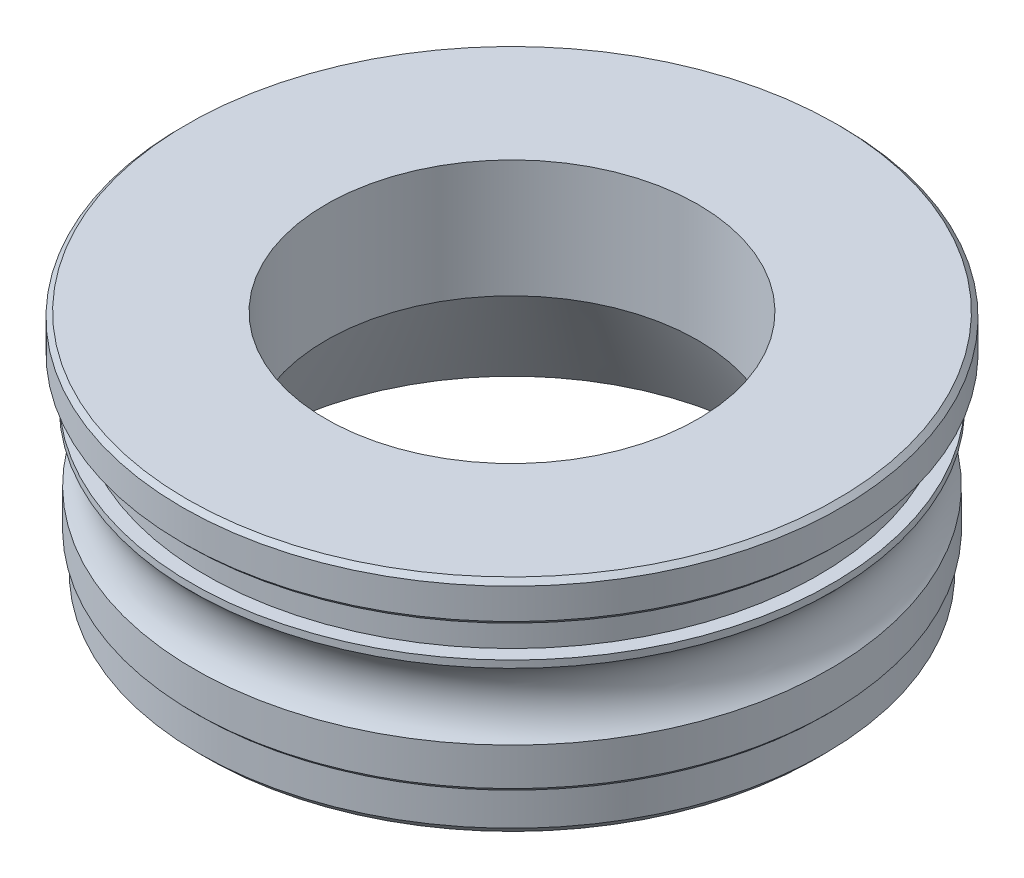
ISO-10303-21;
HEADER;
FILE_DESCRIPTION(('STEP AP214'),'2;1');
FILE_NAME('part.step','',(''),(''),'','','');
FILE_SCHEMA(('AUTOMOTIVE_DESIGN { 1 0 10303 214 1 1 1 1 }'));
ENDSEC;
DATA;
#1=APPLICATION_CONTEXT('core data for automotive mechanical design processes');
#2=APPLICATION_PROTOCOL_DEFINITION('international standard','automotive_design',2000,#1);
#3=PRODUCT_CONTEXT('',#1,'mechanical');
#4=PRODUCT('Part','Part','',(#3));
#5=PRODUCT_RELATED_PRODUCT_CATEGORY('part','',(#4));
#6=PRODUCT_DEFINITION_FORMATION('','',#4);
#7=PRODUCT_DEFINITION_CONTEXT('part definition',#1,'design');
#8=PRODUCT_DEFINITION('design','',#6,#7);
#9=PRODUCT_DEFINITION_SHAPE('','',#8);
#10=(LENGTH_UNIT() NAMED_UNIT(*) SI_UNIT(.MILLI.,.METRE.));
#11=(NAMED_UNIT(*) PLANE_ANGLE_UNIT() SI_UNIT($,.RADIAN.));
#12=(NAMED_UNIT(*) SI_UNIT($,.STERADIAN.) SOLID_ANGLE_UNIT());
#13=UNCERTAINTY_MEASURE_WITH_UNIT(LENGTH_MEASURE(1.E-05),#10,'distance_accuracy_value','');
#14=(GEOMETRIC_REPRESENTATION_CONTEXT(3) GLOBAL_UNCERTAINTY_ASSIGNED_CONTEXT((#13)) GLOBAL_UNIT_ASSIGNED_CONTEXT((#10,
#11,#12)) REPRESENTATION_CONTEXT('',''));
#15=CARTESIAN_POINT('',(0.,0.,0.));
#16=DIRECTION('',(0.,0.,1.));
#17=DIRECTION('',(1.,0.,0.));
#18=AXIS2_PLACEMENT_3D('',#15,#16,#17);
#19=CARTESIAN_POINT('',(5.39337567297407,0.,0.));
#20=DIRECTION('',(0.,-1.,0.));
#21=DIRECTION('',(0.,0.,-1.));
#22=AXIS2_PLACEMENT_3D('',#19,#20,#21);
#23=PLANE('',#22);
#24=CARTESIAN_POINT('',(0.,0.,0.));
#25=DIRECTION('',(0.,-1.,0.));
#26=DIRECTION('',(0.,0.,-1.));
#27=AXIS2_PLACEMENT_3D('',#24,#25,#26);
#28=CIRCLE('',#27,6.45);
#29=CARTESIAN_POINT('',(0.,0.,-6.45));
#30=VERTEX_POINT('',#29);
#31=EDGE_CURVE('E11',#30,#30,#28,.T.);
#32=ORIENTED_EDGE('',*,*,#31,.T.);
#33=EDGE_LOOP('',(#32));
#34=FACE_BOUND('',#33,.T.);
#35=CARTESIAN_POINT('',(0.,0.,0.));
#36=DIRECTION('',(0.,-1.,0.));
#37=DIRECTION('',(0.,0.,-1.));
#38=AXIS2_PLACEMENT_3D('',#35,#36,#37);
#39=CIRCLE('',#38,5.39337567297407);
#40=CARTESIAN_POINT('',(0.,0.,-5.39337567297407));
#41=VERTEX_POINT('',#40);
#42=EDGE_CURVE('E108',#41,#41,#39,.T.);
#43=ORIENTED_EDGE('',*,*,#42,.F.);
#44=EDGE_LOOP('',(#43));
#45=FACE_BOUND('',#44,.T.);
#46=ADVANCED_FACE('F41',(#34,#45),#23,.T.);
#47=CARTESIAN_POINT('',(0.,0.,0.));
#48=DIRECTION('',(0.,1.,0.));
#49=DIRECTION('',(0.,0.,1.));
#50=AXIS2_PLACEMENT_3D('',#47,#48,#49);
#51=CONICAL_SURFACE('',#50,6.45,0.785398163397443);
#52=CARTESIAN_POINT('',(0.,0.2,0.));
#53=DIRECTION('',(0.,-1.,0.));
#54=DIRECTION('',(0.,0.,-1.));
#55=AXIS2_PLACEMENT_3D('',#52,#53,#54);
#56=CIRCLE('',#55,6.65);
#57=CARTESIAN_POINT('',(0.,0.2,-6.65));
#58=VERTEX_POINT('',#57);
#59=EDGE_CURVE('E48',#58,#58,#56,.T.);
#60=ORIENTED_EDGE('',*,*,#59,.T.);
#61=EDGE_LOOP('',(#60));
#62=FACE_BOUND('',#61,.T.);
#63=ORIENTED_EDGE('',*,*,#31,.F.);
#64=EDGE_LOOP('',(#63));
#65=FACE_BOUND('',#64,.T.);
#66=ADVANCED_FACE('F117',(#62,#65),#51,.T.);
#67=CARTESIAN_POINT('',(0.,0.,0.));
#68=DIRECTION('',(0.,-1.,0.));
#69=DIRECTION('',(0.,0.,-1.));
#70=AXIS2_PLACEMENT_3D('',#67,#68,#69);
#71=CYLINDRICAL_SURFACE('',#70,6.65);
#72=CARTESIAN_POINT('',(0.,0.9,0.));
#73=DIRECTION('',(0.,-1.,0.));
#74=DIRECTION('',(0.,0.,-1.));
#75=AXIS2_PLACEMENT_3D('',#72,#73,#74);
#76=CIRCLE('',#75,6.65);
#77=CARTESIAN_POINT('',(0.,0.9,-6.65));
#78=VERTEX_POINT('',#77);
#79=EDGE_CURVE('E53',#78,#78,#76,.T.);
#80=ORIENTED_EDGE('',*,*,#79,.T.);
#81=EDGE_LOOP('',(#80));
#82=FACE_BOUND('',#81,.T.);
#83=ORIENTED_EDGE('',*,*,#59,.F.);
#84=EDGE_LOOP('',(#83));
#85=FACE_BOUND('',#84,.T.);
#86=ADVANCED_FACE('F121',(#82,#85),#71,.T.);
#87=CARTESIAN_POINT('',(0.,0.9,0.));
#88=DIRECTION('',(0.,1.,0.));
#89=DIRECTION('',(0.,0.,1.));
#90=AXIS2_PLACEMENT_3D('',#87,#88,#89);
#91=CONICAL_SURFACE('',#90,6.65,0.785398163397441);
#92=CARTESIAN_POINT('',(0.,1.,0.));
#93=DIRECTION('',(0.,-1.,0.));
#94=DIRECTION('',(0.,0.,-1.));
#95=AXIS2_PLACEMENT_3D('',#92,#93,#94);
#96=CIRCLE('',#95,6.75);
#97=CARTESIAN_POINT('',(0.,1.,-6.75));
#98=VERTEX_POINT('',#97);
#99=EDGE_CURVE('E58',#98,#98,#96,.T.);
#100=ORIENTED_EDGE('',*,*,#99,.T.);
#101=EDGE_LOOP('',(#100));
#102=FACE_BOUND('',#101,.T.);
#103=ORIENTED_EDGE('',*,*,#79,.F.);
#104=EDGE_LOOP('',(#103));
#105=FACE_BOUND('',#104,.T.);
#106=ADVANCED_FACE('F125',(#102,#105),#91,.T.);
#107=CARTESIAN_POINT('',(0.,0.,0.));
#108=DIRECTION('',(0.,-1.,0.));
#109=DIRECTION('',(0.,0.,-1.));
#110=AXIS2_PLACEMENT_3D('',#107,#108,#109);
#111=CYLINDRICAL_SURFACE('',#110,6.75);
#112=CARTESIAN_POINT('',(0.,1.8,0.));
#113=DIRECTION('',(0.,-1.,0.));
#114=DIRECTION('',(0.,0.,-1.));
#115=AXIS2_PLACEMENT_3D('',#112,#113,#114);
#116=CIRCLE('',#115,6.75);
#117=CARTESIAN_POINT('',(0.,1.8,-6.75));
#118=VERTEX_POINT('',#117);
#119=EDGE_CURVE('E64',#118,#118,#116,.T.);
#120=ORIENTED_EDGE('',*,*,#119,.T.);
#121=EDGE_LOOP('',(#120));
#122=FACE_BOUND('',#121,.T.);
#123=ORIENTED_EDGE('',*,*,#99,.F.);
#124=EDGE_LOOP('',(#123));
#125=FACE_BOUND('',#124,.T.);
#126=ADVANCED_FACE('F132',(#122,#125),#111,.T.);
#127=CARTESIAN_POINT('',(0.,2.50006097687241,0.));
#128=DIRECTION('',(0.,-1.,0.));
#129=DIRECTION('',(0.,0.,-1.));
#130=AXIS2_PLACEMENT_3D('',#127,#128,#129);
#131=TOROIDAL_SURFACE('',#130,7.46408306845943,1.);
#132=CARTESIAN_POINT('',(0.,3.24771977484479,0.));
#133=DIRECTION('',(0.,-1.,0.));
#134=DIRECTION('',(0.,0.,-1.));
#135=AXIS2_PLACEMENT_3D('',#132,#133,#134);
#136=CIRCLE('',#135,6.8);
#137=CARTESIAN_POINT('',(0.,3.24771977484479,-6.8));
#138=VERTEX_POINT('',#137);
#139=EDGE_CURVE('E68',#138,#138,#136,.T.);
#140=ORIENTED_EDGE('',*,*,#139,.T.);
#141=EDGE_LOOP('',(#140));
#142=FACE_BOUND('',#141,.T.);
#143=ORIENTED_EDGE('',*,*,#119,.F.);
#144=EDGE_LOOP('',(#143));
#145=FACE_BOUND('',#144,.T.);
#146=ADVANCED_FACE('F136',(#142,#145),#131,.F.);
#147=CARTESIAN_POINT('',(0.,0.,0.));
#148=DIRECTION('',(0.,-1.,0.));
#149=DIRECTION('',(0.,0.,-1.));
#150=AXIS2_PLACEMENT_3D('',#147,#148,#149);
#151=CYLINDRICAL_SURFACE('',#150,6.8);
#152=CARTESIAN_POINT('',(0.,3.4,0.));
#153=DIRECTION('',(0.,-1.,0.));
#154=DIRECTION('',(0.,0.,-1.));
#155=AXIS2_PLACEMENT_3D('',#152,#153,#154);
#156=CIRCLE('',#155,6.8);
#157=CARTESIAN_POINT('',(0.,3.4,-6.8));
#158=VERTEX_POINT('',#157);
#159=EDGE_CURVE('E72',#158,#158,#156,.T.);
#160=ORIENTED_EDGE('',*,*,#159,.T.);
#161=EDGE_LOOP('',(#160));
#162=FACE_BOUND('',#161,.T.);
#163=ORIENTED_EDGE('',*,*,#139,.F.);
#164=EDGE_LOOP('',(#163));
#165=FACE_BOUND('',#164,.T.);
#166=ADVANCED_FACE('F140',(#162,#165),#151,.T.);
#167=CARTESIAN_POINT('',(6.5,3.4,0.));
#168=DIRECTION('',(0.,1.,0.));
#169=DIRECTION('',(0.,0.,1.));
#170=AXIS2_PLACEMENT_3D('',#167,#168,#169);
#171=PLANE('',#170);
#172=CARTESIAN_POINT('',(0.,3.4,0.));
#173=DIRECTION('',(0.,-1.,0.));
#174=DIRECTION('',(0.,0.,-1.));
#175=AXIS2_PLACEMENT_3D('',#172,#173,#174);
#176=CIRCLE('',#175,6.5);
#177=CARTESIAN_POINT('',(0.,3.4,-6.5));
#178=VERTEX_POINT('',#177);
#179=EDGE_CURVE('E76',#178,#178,#176,.T.);
#180=ORIENTED_EDGE('',*,*,#179,.T.);
#181=EDGE_LOOP('',(#180));
#182=FACE_BOUND('',#181,.T.);
#183=ORIENTED_EDGE('',*,*,#159,.F.);
#184=EDGE_LOOP('',(#183));
#185=FACE_BOUND('',#184,.T.);
#186=ADVANCED_FACE('F144',(#182,#185),#171,.T.);
#187=CARTESIAN_POINT('',(0.,0.,0.));
#188=DIRECTION('',(0.,-1.,0.));
#189=DIRECTION('',(0.,0.,-1.));
#190=AXIS2_PLACEMENT_3D('',#187,#188,#189);
#191=CYLINDRICAL_SURFACE('',#190,6.5);
#192=CARTESIAN_POINT('',(0.,4.15,0.));
#193=DIRECTION('',(0.,-1.,0.));
#194=DIRECTION('',(0.,0.,-1.));
#195=AXIS2_PLACEMENT_3D('',#192,#193,#194);
#196=CIRCLE('',#195,6.5);
#197=CARTESIAN_POINT('',(0.,4.15,-6.5));
#198=VERTEX_POINT('',#197);
#199=EDGE_CURVE('E80',#198,#198,#196,.T.);
#200=ORIENTED_EDGE('',*,*,#199,.T.);
#201=EDGE_LOOP('',(#200));
#202=FACE_BOUND('',#201,.T.);
#203=ORIENTED_EDGE('',*,*,#179,.F.);
#204=EDGE_LOOP('',(#203));
#205=FACE_BOUND('',#204,.T.);
#206=ADVANCED_FACE('F148',(#202,#205),#191,.T.);
#207=CARTESIAN_POINT('',(6.9,4.15,0.));
#208=DIRECTION('',(0.,-1.,0.));
#209=DIRECTION('',(0.,0.,-1.));
#210=AXIS2_PLACEMENT_3D('',#207,#208,#209);
#211=PLANE('',#210);
#212=CARTESIAN_POINT('',(0.,4.15,0.));
#213=DIRECTION('',(0.,-1.,0.));
#214=DIRECTION('',(0.,0.,-1.));
#215=AXIS2_PLACEMENT_3D('',#212,#213,#214);
#216=CIRCLE('',#215,6.9);
#217=CARTESIAN_POINT('',(0.,4.15,-6.9));
#218=VERTEX_POINT('',#217);
#219=EDGE_CURVE('E84',#218,#218,#216,.T.);
#220=ORIENTED_EDGE('',*,*,#219,.T.);
#221=EDGE_LOOP('',(#220));
#222=FACE_BOUND('',#221,.T.);
#223=ORIENTED_EDGE('',*,*,#199,.F.);
#224=EDGE_LOOP('',(#223));
#225=FACE_BOUND('',#224,.T.);
#226=ADVANCED_FACE('F152',(#222,#225),#211,.T.);
#227=CARTESIAN_POINT('',(0.,4.15,0.));
#228=DIRECTION('',(0.,1.,0.));
#229=DIRECTION('',(0.,0.,1.));
#230=AXIS2_PLACEMENT_3D('',#227,#228,#229);
#231=CONICAL_SURFACE('',#230,6.9,0.785398163397448);
#232=CARTESIAN_POINT('',(0.,4.25,0.));
#233=DIRECTION('',(0.,-1.,0.));
#234=DIRECTION('',(0.,0.,-1.));
#235=AXIS2_PLACEMENT_3D('',#232,#233,#234);
#236=CIRCLE('',#235,7.);
#237=CARTESIAN_POINT('',(0.,4.25,-7.));
#238=VERTEX_POINT('',#237);
#239=EDGE_CURVE('E88',#238,#238,#236,.T.);
#240=ORIENTED_EDGE('',*,*,#239,.T.);
#241=EDGE_LOOP('',(#240));
#242=FACE_BOUND('',#241,.T.);
#243=ORIENTED_EDGE('',*,*,#219,.F.);
#244=EDGE_LOOP('',(#243));
#245=FACE_BOUND('',#244,.T.);
#246=ADVANCED_FACE('F156',(#242,#245),#231,.T.);
#247=CARTESIAN_POINT('',(0.,0.,0.));
#248=DIRECTION('',(0.,-1.,0.));
#249=DIRECTION('',(0.,0.,-1.));
#250=AXIS2_PLACEMENT_3D('',#247,#248,#249);
#251=CYLINDRICAL_SURFACE('',#250,7.);
#252=CARTESIAN_POINT('',(0.,4.9,0.));
#253=DIRECTION('',(0.,-1.,0.));
#254=DIRECTION('',(0.,0.,-1.));
#255=AXIS2_PLACEMENT_3D('',#252,#253,#254);
#256=CIRCLE('',#255,7.);
#257=CARTESIAN_POINT('',(0.,4.9,-7.));
#258=VERTEX_POINT('',#257);
#259=EDGE_CURVE('E92',#258,#258,#256,.T.);
#260=ORIENTED_EDGE('',*,*,#259,.T.);
#261=EDGE_LOOP('',(#260));
#262=FACE_BOUND('',#261,.T.);
#263=ORIENTED_EDGE('',*,*,#239,.F.);
#264=EDGE_LOOP('',(#263));
#265=FACE_BOUND('',#264,.T.);
#266=ADVANCED_FACE('F160',(#262,#265),#251,.T.);
#267=CARTESIAN_POINT('',(0.,4.9,0.));
#268=DIRECTION('',(0.,-1.,0.));
#269=DIRECTION('',(0.,0.,-1.));
#270=AXIS2_PLACEMENT_3D('',#267,#268,#269);
#271=CONICAL_SURFACE('',#270,7.,0.785398163397448);
#272=CARTESIAN_POINT('',(0.,5.,0.));
#273=DIRECTION('',(0.,-1.,0.));
#274=DIRECTION('',(0.,0.,-1.));
#275=AXIS2_PLACEMENT_3D('',#272,#273,#274);
#276=CIRCLE('',#275,6.9);
#277=CARTESIAN_POINT('',(0.,5.,-6.9));
#278=VERTEX_POINT('',#277);
#279=EDGE_CURVE('E96',#278,#278,#276,.T.);
#280=ORIENTED_EDGE('',*,*,#279,.T.);
#281=EDGE_LOOP('',(#280));
#282=FACE_BOUND('',#281,.T.);
#283=ORIENTED_EDGE('',*,*,#259,.F.);
#284=EDGE_LOOP('',(#283));
#285=FACE_BOUND('',#284,.T.);
#286=ADVANCED_FACE('F164',(#282,#285),#271,.T.);
#287=CARTESIAN_POINT('',(3.95,5.,0.));
#288=DIRECTION('',(0.,1.,0.));
#289=DIRECTION('',(0.,0.,1.));
#290=AXIS2_PLACEMENT_3D('',#287,#288,#289);
#291=PLANE('',#290);
#292=CARTESIAN_POINT('',(0.,5.,0.));
#293=DIRECTION('',(0.,-1.,0.));
#294=DIRECTION('',(0.,0.,-1.));
#295=AXIS2_PLACEMENT_3D('',#292,#293,#294);
#296=CIRCLE('',#295,3.95);
#297=CARTESIAN_POINT('',(0.,5.,-3.95));
#298=VERTEX_POINT('',#297);
#299=EDGE_CURVE('E100',#298,#298,#296,.T.);
#300=ORIENTED_EDGE('',*,*,#299,.T.);
#301=EDGE_LOOP('',(#300));
#302=FACE_BOUND('',#301,.T.);
#303=ORIENTED_EDGE('',*,*,#279,.F.);
#304=EDGE_LOOP('',(#303));
#305=FACE_BOUND('',#304,.T.);
#306=ADVANCED_FACE('F168',(#302,#305),#291,.T.);
#307=CARTESIAN_POINT('',(0.,0.,0.));
#308=DIRECTION('',(0.,-1.,0.));
#309=DIRECTION('',(0.,0.,-1.));
#310=AXIS2_PLACEMENT_3D('',#307,#308,#309);
#311=CYLINDRICAL_SURFACE('',#310,3.95);
#312=CARTESIAN_POINT('',(0.,2.5,0.));
#313=DIRECTION('',(0.,-1.,0.));
#314=DIRECTION('',(0.,0.,-1.));
#315=AXIS2_PLACEMENT_3D('',#312,#313,#314);
#316=CIRCLE('',#315,3.95);
#317=CARTESIAN_POINT('',(0.,2.5,-3.95));
#318=VERTEX_POINT('',#317);
#319=EDGE_CURVE('E104',#318,#318,#316,.T.);
#320=ORIENTED_EDGE('',*,*,#319,.T.);
#321=EDGE_LOOP('',(#320));
#322=FACE_BOUND('',#321,.T.);
#323=ORIENTED_EDGE('',*,*,#299,.F.);
#324=EDGE_LOOP('',(#323));
#325=FACE_BOUND('',#324,.T.);
#326=ADVANCED_FACE('F172',(#322,#325),#311,.F.);
#327=CARTESIAN_POINT('',(0.,2.5,0.));
#328=DIRECTION('',(0.,-1.,0.));
#329=DIRECTION('',(0.,0.,-1.));
#330=AXIS2_PLACEMENT_3D('',#327,#328,#329);
#331=CONICAL_SURFACE('',#330,3.95,0.523598775598301);
#332=ORIENTED_EDGE('',*,*,#42,.T.);
#333=EDGE_LOOP('',(#332));
#334=FACE_BOUND('',#333,.T.);
#335=ORIENTED_EDGE('',*,*,#319,.F.);
#336=EDGE_LOOP('',(#335));
#337=FACE_BOUND('',#336,.T.);
#338=ADVANCED_FACE('F113',(#334,#337),#331,.F.);
#339=CLOSED_SHELL('',(#46,#66,#86,#106,#126,#146,#166,#186,#206,#226,#246,#266,#286,#306,#326,#338));
#340=MANIFOLD_SOLID_BREP('B2',#339);
#341=ADVANCED_BREP_SHAPE_REPRESENTATION('',(#18,#340),#14);
#342=SHAPE_DEFINITION_REPRESENTATION(#9,#341);
ENDSEC;
END-ISO-10303-21;
